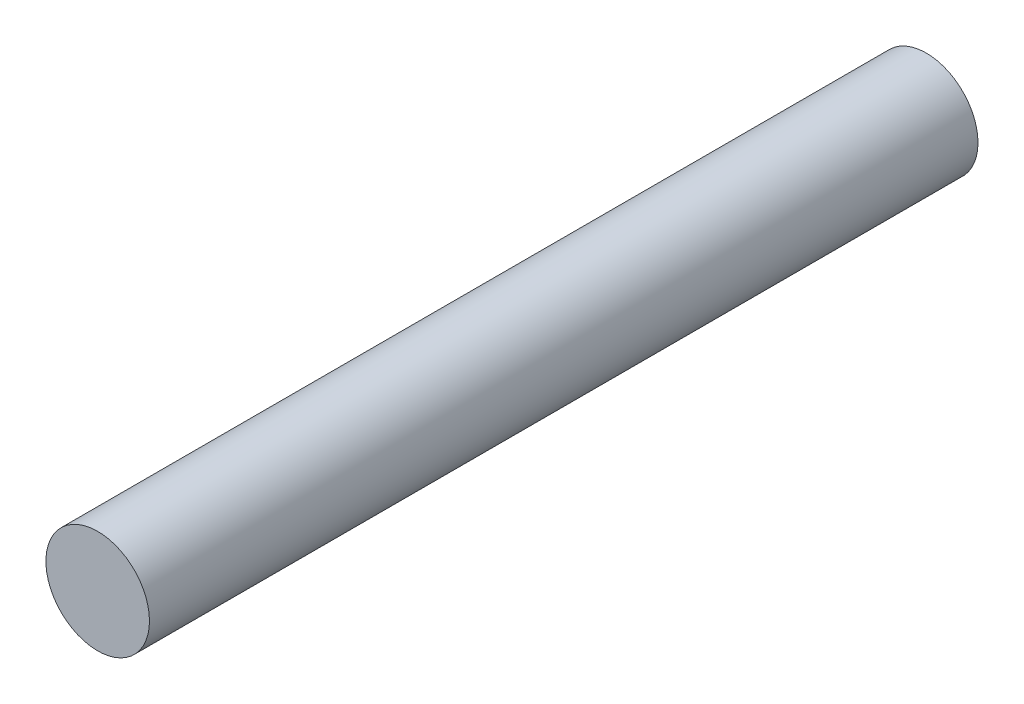
ISO-10303-21;
HEADER;
FILE_DESCRIPTION(('STEP AP214'),'2;1');
FILE_NAME('part.step','',(''),(''),'','','');
FILE_SCHEMA(('AUTOMOTIVE_DESIGN { 1 0 10303 214 1 1 1 1 }'));
ENDSEC;
DATA;
#1=APPLICATION_CONTEXT('core data for automotive mechanical design processes');
#2=APPLICATION_PROTOCOL_DEFINITION('international standard','automotive_design',2000,#1);
#3=PRODUCT_CONTEXT('',#1,'mechanical');
#4=PRODUCT('Part','Part','',(#3));
#5=PRODUCT_RELATED_PRODUCT_CATEGORY('part','',(#4));
#6=PRODUCT_DEFINITION_FORMATION('','',#4);
#7=PRODUCT_DEFINITION_CONTEXT('part definition',#1,'design');
#8=PRODUCT_DEFINITION('design','',#6,#7);
#9=PRODUCT_DEFINITION_SHAPE('','',#8);
#10=(LENGTH_UNIT() NAMED_UNIT(*) SI_UNIT(.MILLI.,.METRE.));
#11=(NAMED_UNIT(*) PLANE_ANGLE_UNIT() SI_UNIT($,.RADIAN.));
#12=(NAMED_UNIT(*) SI_UNIT($,.STERADIAN.) SOLID_ANGLE_UNIT());
#13=UNCERTAINTY_MEASURE_WITH_UNIT(LENGTH_MEASURE(1.E-05),#10,'distance_accuracy_value','');
#14=(GEOMETRIC_REPRESENTATION_CONTEXT(3) GLOBAL_UNCERTAINTY_ASSIGNED_CONTEXT((#13)) GLOBAL_UNIT_ASSIGNED_CONTEXT((#10,
#11,#12)) REPRESENTATION_CONTEXT('',''));
#15=CARTESIAN_POINT('',(0.,0.,0.));
#16=DIRECTION('',(0.,0.,1.));
#17=DIRECTION('',(1.,0.,0.));
#18=AXIS2_PLACEMENT_3D('',#15,#16,#17);
#19=CARTESIAN_POINT('',(0.,0.,40.));
#20=DIRECTION('',(0.,0.,-1.));
#21=DIRECTION('',(-1.,0.,0.));
#22=AXIS2_PLACEMENT_3D('',#19,#20,#21);
#23=CYLINDRICAL_SURFACE('',#22,2.5);
#24=CARTESIAN_POINT('',(0.,0.,40.));
#25=DIRECTION('',(0.,0.,1.));
#26=DIRECTION('',(1.,0.,0.));
#27=AXIS2_PLACEMENT_3D('',#24,#25,#26);
#28=CIRCLE('',#27,2.5);
#29=CARTESIAN_POINT('',(2.5,0.,40.));
#30=VERTEX_POINT('',#29);
#31=EDGE_CURVE('E10',#30,#30,#28,.T.);
#32=ORIENTED_EDGE('',*,*,#31,.F.);
#33=EDGE_LOOP('',(#32));
#34=FACE_BOUND('',#33,.T.);
#35=CARTESIAN_POINT('',(0.,0.,0.));
#36=DIRECTION('',(0.,0.,1.));
#37=DIRECTION('',(1.,0.,0.));
#38=AXIS2_PLACEMENT_3D('',#35,#36,#37);
#39=CIRCLE('',#38,2.5);
#40=CARTESIAN_POINT('',(2.5,0.,0.));
#41=VERTEX_POINT('',#40);
#42=EDGE_CURVE('E34',#41,#41,#39,.T.);
#43=ORIENTED_EDGE('',*,*,#42,.T.);
#44=EDGE_LOOP('',(#43));
#45=FACE_BOUND('',#44,.T.);
#46=ADVANCED_FACE('F31',(#34,#45),#23,.T.);
#47=CARTESIAN_POINT('',(0.,0.,40.));
#48=DIRECTION('',(0.,0.,1.));
#49=DIRECTION('',(1.,0.,0.));
#50=AXIS2_PLACEMENT_3D('',#47,#48,#49);
#51=PLANE('',#50);
#52=ORIENTED_EDGE('',*,*,#31,.T.);
#53=EDGE_LOOP('',(#52));
#54=FACE_BOUND('',#53,.T.);
#55=ADVANCED_FACE('F46',(#54),#51,.T.);
#56=CARTESIAN_POINT('',(0.,0.,0.));
#57=DIRECTION('',(0.,0.,1.));
#58=DIRECTION('',(1.,0.,0.));
#59=AXIS2_PLACEMENT_3D('',#56,#57,#58);
#60=PLANE('',#59);
#61=ORIENTED_EDGE('',*,*,#42,.F.);
#62=EDGE_LOOP('',(#61));
#63=FACE_BOUND('',#62,.T.);
#64=ADVANCED_FACE('F44',(#63),#60,.F.);
#65=CLOSED_SHELL('',(#46,#55,#64));
#66=MANIFOLD_SOLID_BREP('B2',#65);
#67=ADVANCED_BREP_SHAPE_REPRESENTATION('',(#18,#66),#14);
#68=SHAPE_DEFINITION_REPRESENTATION(#9,#67);
ENDSEC;
END-ISO-10303-21;
